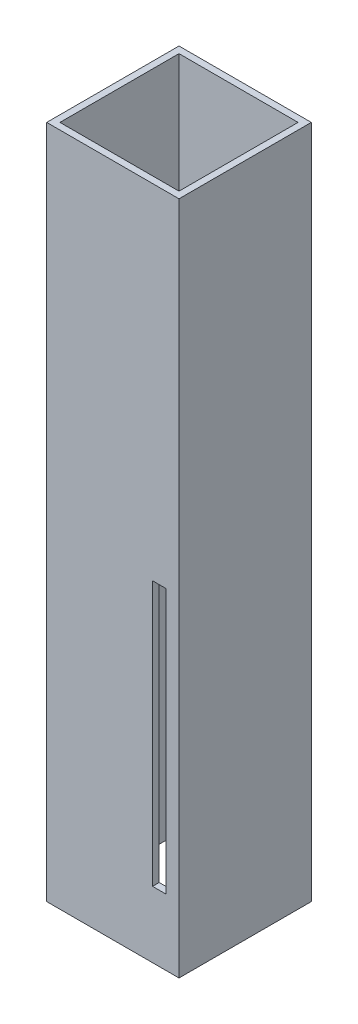
ISO-10303-21;
HEADER;
FILE_DESCRIPTION(('STEP AP214'),'2;1');
FILE_NAME('part.step','',(''),(''),'','','');
FILE_SCHEMA(('AUTOMOTIVE_DESIGN { 1 0 10303 214 1 1 1 1 }'));
ENDSEC;
DATA;
#1=APPLICATION_CONTEXT('core data for automotive mechanical design processes');
#2=APPLICATION_PROTOCOL_DEFINITION('international standard','automotive_design',2000,#1);
#3=PRODUCT_CONTEXT('',#1,'mechanical');
#4=PRODUCT('Part','Part','',(#3));
#5=PRODUCT_RELATED_PRODUCT_CATEGORY('part','',(#4));
#6=PRODUCT_DEFINITION_FORMATION('','',#4);
#7=PRODUCT_DEFINITION_CONTEXT('part definition',#1,'design');
#8=PRODUCT_DEFINITION('design','',#6,#7);
#9=PRODUCT_DEFINITION_SHAPE('','',#8);
#10=(LENGTH_UNIT() NAMED_UNIT(*) SI_UNIT(.MILLI.,.METRE.));
#11=(NAMED_UNIT(*) PLANE_ANGLE_UNIT() SI_UNIT($,.RADIAN.));
#12=(NAMED_UNIT(*) SI_UNIT($,.STERADIAN.) SOLID_ANGLE_UNIT());
#13=UNCERTAINTY_MEASURE_WITH_UNIT(LENGTH_MEASURE(1.E-05),#10,'distance_accuracy_value','');
#14=(GEOMETRIC_REPRESENTATION_CONTEXT(3) GLOBAL_UNCERTAINTY_ASSIGNED_CONTEXT((#13)) GLOBAL_UNIT_ASSIGNED_CONTEXT((#10,
#11,#12)) REPRESENTATION_CONTEXT('',''));
#15=CARTESIAN_POINT('',(0.,0.,0.));
#16=DIRECTION('',(0.,0.,1.));
#17=DIRECTION('',(1.,0.,0.));
#18=AXIS2_PLACEMENT_3D('',#15,#16,#17);
#19=CARTESIAN_POINT('',(0.,25.5,0.));
#20=DIRECTION('',(0.,-1.,0.));
#21=DIRECTION('',(0.,0.,-1.));
#22=AXIS2_PLACEMENT_3D('',#19,#20,#21);
#23=PLANE('',#22);
#24=DIRECTION('',(0.,0.,-1.));
#25=VECTOR('',#24,1.);
#26=CARTESIAN_POINT('',(2.50000000000003,25.5,2.5));
#27=LINE('',#26,#25);
#28=CARTESIAN_POINT('',(2.50000000000003,25.5,2.5));
#29=VERTEX_POINT('',#28);
#30=CARTESIAN_POINT('',(2.50000000000003,25.5,-2.5));
#31=VERTEX_POINT('',#30);
#32=EDGE_CURVE('E232',#29,#31,#27,.T.);
#33=ORIENTED_EDGE('',*,*,#32,.T.);
#34=DIRECTION('',(-1.,0.,0.));
#35=VECTOR('',#34,1.);
#36=CARTESIAN_POINT('',(-2.49999999999997,25.5,-2.5));
#37=LINE('',#36,#35);
#38=CARTESIAN_POINT('',(-2.49999999999997,25.5,-2.5));
#39=VERTEX_POINT('',#38);
#40=EDGE_CURVE('E235',#31,#39,#37,.T.);
#41=ORIENTED_EDGE('',*,*,#40,.T.);
#42=DIRECTION('',(0.,0.,1.));
#43=VECTOR('',#42,1.);
#44=CARTESIAN_POINT('',(-2.49999999999997,25.5,2.5));
#45=LINE('',#44,#43);
#46=CARTESIAN_POINT('',(-2.49999999999997,25.5,2.5));
#47=VERTEX_POINT('',#46);
#48=EDGE_CURVE('E238',#39,#47,#45,.T.);
#49=ORIENTED_EDGE('',*,*,#48,.T.);
#50=DIRECTION('',(1.,0.,0.));
#51=VECTOR('',#50,1.);
#52=CARTESIAN_POINT('',(-2.49999999999997,25.5,2.5));
#53=LINE('',#52,#51);
#54=EDGE_CURVE('E240',#47,#29,#53,.T.);
#55=ORIENTED_EDGE('',*,*,#54,.T.);
#56=EDGE_LOOP('',(#33,#41,#49,#55));
#57=FACE_BOUND('',#56,.T.);
#58=DIRECTION('',(0.,0.,-1.));
#59=VECTOR('',#58,1.);
#60=CARTESIAN_POINT('',(2.25000000000003,25.5,2.25));
#61=LINE('',#60,#59);
#62=CARTESIAN_POINT('',(2.25000000000003,25.5,2.25));
#63=VERTEX_POINT('',#62);
#64=CARTESIAN_POINT('',(2.25000000000003,25.5,-2.25));
#65=VERTEX_POINT('',#64);
#66=EDGE_CURVE('E201',#63,#65,#61,.T.);
#67=ORIENTED_EDGE('',*,*,#66,.F.);
#68=DIRECTION('',(1.,0.,0.));
#69=VECTOR('',#68,1.);
#70=CARTESIAN_POINT('',(-2.24999999999997,25.5,2.25));
#71=LINE('',#70,#69);
#72=CARTESIAN_POINT('',(-2.24999999999997,25.5,2.25));
#73=VERTEX_POINT('',#72);
#74=EDGE_CURVE('E209',#73,#63,#71,.T.);
#75=ORIENTED_EDGE('',*,*,#74,.F.);
#76=DIRECTION('',(0.,0.,1.));
#77=VECTOR('',#76,1.);
#78=CARTESIAN_POINT('',(-2.24999999999997,25.5,2.25));
#79=LINE('',#78,#77);
#80=CARTESIAN_POINT('',(-2.24999999999997,25.5,-2.25));
#81=VERTEX_POINT('',#80);
#82=EDGE_CURVE('E206',#81,#73,#79,.T.);
#83=ORIENTED_EDGE('',*,*,#82,.F.);
#84=DIRECTION('',(-1.,0.,0.));
#85=VECTOR('',#84,1.);
#86=CARTESIAN_POINT('',(-2.24999999999997,25.5,-2.25));
#87=LINE('',#86,#85);
#88=EDGE_CURVE('E203',#65,#81,#87,.T.);
#89=ORIENTED_EDGE('',*,*,#88,.F.);
#90=EDGE_LOOP('',(#67,#75,#83,#89));
#91=FACE_BOUND('',#90,.T.);
#92=ADVANCED_FACE('F33',(#57,#91),#23,.F.);
#93=CARTESIAN_POINT('',(0.,0.,0.));
#94=DIRECTION('',(0.,-1.,0.));
#95=DIRECTION('',(0.,0.,-1.));
#96=AXIS2_PLACEMENT_3D('',#93,#94,#95);
#97=PLANE('',#96);
#98=DIRECTION('',(0.,0.,-1.));
#99=VECTOR('',#98,1.);
#100=CARTESIAN_POINT('',(2.50000000000003,0.,2.5));
#101=LINE('',#100,#99);
#102=CARTESIAN_POINT('',(2.50000000000003,0.,2.5));
#103=VERTEX_POINT('',#102);
#104=CARTESIAN_POINT('',(2.50000000000003,0.,-2.5));
#105=VERTEX_POINT('',#104);
#106=EDGE_CURVE('E231',#103,#105,#101,.T.);
#107=ORIENTED_EDGE('',*,*,#106,.F.);
#108=DIRECTION('',(1.,0.,0.));
#109=VECTOR('',#108,1.);
#110=CARTESIAN_POINT('',(-2.49999999999997,0.,2.5));
#111=LINE('',#110,#109);
#112=CARTESIAN_POINT('',(-2.49999999999997,0.,2.5));
#113=VERTEX_POINT('',#112);
#114=EDGE_CURVE('E236',#113,#103,#111,.T.);
#115=ORIENTED_EDGE('',*,*,#114,.F.);
#116=DIRECTION('',(0.,0.,1.));
#117=VECTOR('',#116,1.);
#118=CARTESIAN_POINT('',(-2.49999999999997,0.,2.5));
#119=LINE('',#118,#117);
#120=CARTESIAN_POINT('',(-2.49999999999997,0.,-2.5));
#121=VERTEX_POINT('',#120);
#122=EDGE_CURVE('E247',#121,#113,#119,.T.);
#123=ORIENTED_EDGE('',*,*,#122,.F.);
#124=DIRECTION('',(-1.,0.,0.));
#125=VECTOR('',#124,1.);
#126=CARTESIAN_POINT('',(-2.49999999999997,0.,-2.5));
#127=LINE('',#126,#125);
#128=EDGE_CURVE('E245',#105,#121,#127,.T.);
#129=ORIENTED_EDGE('',*,*,#128,.F.);
#130=EDGE_LOOP('',(#107,#115,#123,#129));
#131=FACE_BOUND('',#130,.T.);
#132=DIRECTION('',(1.,0.,0.));
#133=VECTOR('',#132,1.);
#134=CARTESIAN_POINT('',(-2.24999999999997,0.,2.25));
#135=LINE('',#134,#133);
#136=CARTESIAN_POINT('',(-2.24999999999997,0.,2.25));
#137=VERTEX_POINT('',#136);
#138=CARTESIAN_POINT('',(2.25000000000003,0.,2.25));
#139=VERTEX_POINT('',#138);
#140=EDGE_CURVE('E204',#137,#139,#135,.T.);
#141=ORIENTED_EDGE('',*,*,#140,.T.);
#142=DIRECTION('',(0.,0.,-1.));
#143=VECTOR('',#142,1.);
#144=CARTESIAN_POINT('',(2.25000000000003,0.,2.25));
#145=LINE('',#144,#143);
#146=CARTESIAN_POINT('',(2.25000000000003,0.,-2.25));
#147=VERTEX_POINT('',#146);
#148=EDGE_CURVE('E200',#139,#147,#145,.T.);
#149=ORIENTED_EDGE('',*,*,#148,.T.);
#150=DIRECTION('',(-1.,0.,0.));
#151=VECTOR('',#150,1.);
#152=CARTESIAN_POINT('',(-2.24999999999997,0.,-2.25));
#153=LINE('',#152,#151);
#154=CARTESIAN_POINT('',(-2.24999999999997,0.,-2.25));
#155=VERTEX_POINT('',#154);
#156=EDGE_CURVE('E214',#147,#155,#153,.T.);
#157=ORIENTED_EDGE('',*,*,#156,.T.);
#158=DIRECTION('',(0.,0.,1.));
#159=VECTOR('',#158,1.);
#160=CARTESIAN_POINT('',(-2.24999999999997,0.,2.25));
#161=LINE('',#160,#159);
#162=EDGE_CURVE('E217',#155,#137,#161,.T.);
#163=ORIENTED_EDGE('',*,*,#162,.T.);
#164=EDGE_LOOP('',(#141,#149,#157,#163));
#165=FACE_BOUND('',#164,.T.);
#166=ADVANCED_FACE('F301',(#131,#165),#97,.T.);
#167=CARTESIAN_POINT('',(2.50000000000003,25.5,2.5));
#168=DIRECTION('',(-1.,0.,0.));
#169=DIRECTION('',(0.,0.,1.));
#170=AXIS2_PLACEMENT_3D('',#167,#168,#169);
#171=PLANE('',#170);
#172=ORIENTED_EDGE('',*,*,#106,.T.);
#173=DIRECTION('',(0.,-1.,0.));
#174=VECTOR('',#173,1.);
#175=CARTESIAN_POINT('',(2.50000000000003,25.5,-2.5));
#176=LINE('',#175,#174);
#177=EDGE_CURVE('E258',#31,#105,#176,.T.);
#178=ORIENTED_EDGE('',*,*,#177,.F.);
#179=ORIENTED_EDGE('',*,*,#32,.F.);
#180=DIRECTION('',(0.,-1.,0.));
#181=VECTOR('',#180,1.);
#182=CARTESIAN_POINT('',(2.50000000000003,25.5,2.5));
#183=LINE('',#182,#181);
#184=EDGE_CURVE('E242',#29,#103,#183,.T.);
#185=ORIENTED_EDGE('',*,*,#184,.T.);
#186=EDGE_LOOP('',(#172,#178,#179,#185));
#187=FACE_BOUND('',#186,.T.);
#188=ADVANCED_FACE('F35',(#187),#171,.F.);
#189=CARTESIAN_POINT('',(-2.49999999999997,25.5,-2.5));
#190=DIRECTION('',(0.,0.,1.));
#191=DIRECTION('',(1.,0.,0.));
#192=AXIS2_PLACEMENT_3D('',#189,#190,#191);
#193=PLANE('',#192);
#194=DIRECTION('',(-1.,0.,0.));
#195=VECTOR('',#194,1.);
#196=CARTESIAN_POINT('',(1.50000000000003,12.5,-2.5));
#197=LINE('',#196,#195);
#198=CARTESIAN_POINT('',(2.00000000000003,12.5,-2.5));
#199=VERTEX_POINT('',#198);
#200=CARTESIAN_POINT('',(1.50000000000003,12.5,-2.5));
#201=VERTEX_POINT('',#200);
#202=EDGE_CURVE('E168',#199,#201,#197,.T.);
#203=ORIENTED_EDGE('',*,*,#202,.T.);
#204=DIRECTION('',(0.,-1.,0.));
#205=VECTOR('',#204,1.);
#206=CARTESIAN_POINT('',(1.50000000000003,2.5,-2.5));
#207=LINE('',#206,#205);
#208=CARTESIAN_POINT('',(1.50000000000003,2.5,-2.5));
#209=VERTEX_POINT('',#208);
#210=EDGE_CURVE('E151',#201,#209,#207,.T.);
#211=ORIENTED_EDGE('',*,*,#210,.T.);
#212=DIRECTION('',(1.,0.,0.));
#213=VECTOR('',#212,1.);
#214=CARTESIAN_POINT('',(1.50000000000003,2.5,-2.5));
#215=LINE('',#214,#213);
#216=CARTESIAN_POINT('',(2.00000000000003,2.5,-2.5));
#217=VERTEX_POINT('',#216);
#218=EDGE_CURVE('E160',#209,#217,#215,.T.);
#219=ORIENTED_EDGE('',*,*,#218,.T.);
#220=DIRECTION('',(0.,1.,0.));
#221=VECTOR('',#220,1.);
#222=CARTESIAN_POINT('',(2.00000000000003,2.5,-2.5));
#223=LINE('',#222,#221);
#224=EDGE_CURVE('E48',#217,#199,#223,.T.);
#225=ORIENTED_EDGE('',*,*,#224,.T.);
#226=EDGE_LOOP('',(#203,#211,#219,#225));
#227=FACE_BOUND('',#226,.T.);
#228=ORIENTED_EDGE('',*,*,#128,.T.);
#229=DIRECTION('',(0.,-1.,0.));
#230=VECTOR('',#229,1.);
#231=CARTESIAN_POINT('',(-2.49999999999997,25.5,-2.5));
#232=LINE('',#231,#230);
#233=EDGE_CURVE('E255',#39,#121,#232,.T.);
#234=ORIENTED_EDGE('',*,*,#233,.F.);
#235=ORIENTED_EDGE('',*,*,#40,.F.);
#236=ORIENTED_EDGE('',*,*,#177,.T.);
#237=EDGE_LOOP('',(#228,#234,#235,#236));
#238=FACE_BOUND('',#237,.T.);
#239=ADVANCED_FACE('F165',(#227,#238),#193,.F.);
#240=CARTESIAN_POINT('',(-2.49999999999997,25.5,2.5));
#241=DIRECTION('',(1.,0.,0.));
#242=DIRECTION('',(0.,0.,-1.));
#243=AXIS2_PLACEMENT_3D('',#240,#241,#242);
#244=PLANE('',#243);
#245=ORIENTED_EDGE('',*,*,#122,.T.);
#246=DIRECTION('',(0.,-1.,0.));
#247=VECTOR('',#246,1.);
#248=CARTESIAN_POINT('',(-2.49999999999997,25.5,2.5));
#249=LINE('',#248,#247);
#250=EDGE_CURVE('E252',#47,#113,#249,.T.);
#251=ORIENTED_EDGE('',*,*,#250,.F.);
#252=ORIENTED_EDGE('',*,*,#48,.F.);
#253=ORIENTED_EDGE('',*,*,#233,.T.);
#254=EDGE_LOOP('',(#245,#251,#252,#253));
#255=FACE_BOUND('',#254,.T.);
#256=ADVANCED_FACE('F289',(#255),#244,.F.);
#257=CARTESIAN_POINT('',(-2.49999999999997,25.5,2.5));
#258=DIRECTION('',(0.,0.,-1.));
#259=DIRECTION('',(-1.,0.,0.));
#260=AXIS2_PLACEMENT_3D('',#257,#258,#259);
#261=PLANE('',#260);
#262=DIRECTION('',(-1.,0.,0.));
#263=VECTOR('',#262,1.);
#264=CARTESIAN_POINT('',(-2.49999999999997,2.5,2.5));
#265=LINE('',#264,#263);
#266=CARTESIAN_POINT('',(2.00000000000003,2.5,2.5));
#267=VERTEX_POINT('',#266);
#268=CARTESIAN_POINT('',(1.50000000000003,2.5,2.5));
#269=VERTEX_POINT('',#268);
#270=EDGE_CURVE('E183',#267,#269,#265,.T.);
#271=ORIENTED_EDGE('',*,*,#270,.T.);
#272=DIRECTION('',(0.,1.,0.));
#273=VECTOR('',#272,1.);
#274=CARTESIAN_POINT('',(1.50000000000003,25.5,2.5));
#275=LINE('',#274,#273);
#276=CARTESIAN_POINT('',(1.50000000000003,12.5,2.5));
#277=VERTEX_POINT('',#276);
#278=EDGE_CURVE('E197',#269,#277,#275,.T.);
#279=ORIENTED_EDGE('',*,*,#278,.T.);
#280=DIRECTION('',(1.,0.,0.));
#281=VECTOR('',#280,1.);
#282=CARTESIAN_POINT('',(-2.49999999999997,12.5,2.5));
#283=LINE('',#282,#281);
#284=CARTESIAN_POINT('',(2.00000000000003,12.5,2.5));
#285=VERTEX_POINT('',#284);
#286=EDGE_CURVE('E193',#277,#285,#283,.T.);
#287=ORIENTED_EDGE('',*,*,#286,.T.);
#288=DIRECTION('',(0.,-1.,0.));
#289=VECTOR('',#288,1.);
#290=CARTESIAN_POINT('',(2.00000000000003,25.5,2.5));
#291=LINE('',#290,#289);
#292=EDGE_CURVE('E188',#285,#267,#291,.T.);
#293=ORIENTED_EDGE('',*,*,#292,.T.);
#294=EDGE_LOOP('',(#271,#279,#287,#293));
#295=FACE_BOUND('',#294,.T.);
#296=ORIENTED_EDGE('',*,*,#114,.T.);
#297=ORIENTED_EDGE('',*,*,#184,.F.);
#298=ORIENTED_EDGE('',*,*,#54,.F.);
#299=ORIENTED_EDGE('',*,*,#250,.T.);
#300=EDGE_LOOP('',(#296,#297,#298,#299));
#301=FACE_BOUND('',#300,.T.);
#302=ADVANCED_FACE('F285',(#295,#301),#261,.F.);
#303=CARTESIAN_POINT('',(2.25000000000003,25.5,2.25));
#304=DIRECTION('',(-1.,0.,0.));
#305=DIRECTION('',(0.,0.,1.));
#306=AXIS2_PLACEMENT_3D('',#303,#304,#305);
#307=PLANE('',#306);
#308=ORIENTED_EDGE('',*,*,#148,.F.);
#309=DIRECTION('',(0.,-1.,0.));
#310=VECTOR('',#309,1.);
#311=CARTESIAN_POINT('',(2.25000000000003,25.5,2.25));
#312=LINE('',#311,#310);
#313=EDGE_CURVE('E211',#63,#139,#312,.T.);
#314=ORIENTED_EDGE('',*,*,#313,.F.);
#315=ORIENTED_EDGE('',*,*,#66,.T.);
#316=DIRECTION('',(0.,-1.,0.));
#317=VECTOR('',#316,1.);
#318=CARTESIAN_POINT('',(2.25000000000003,25.5,-2.25));
#319=LINE('',#318,#317);
#320=EDGE_CURVE('E228',#65,#147,#319,.T.);
#321=ORIENTED_EDGE('',*,*,#320,.T.);
#322=EDGE_LOOP('',(#308,#314,#315,#321));
#323=FACE_BOUND('',#322,.T.);
#324=ADVANCED_FACE('F288',(#323),#307,.T.);
#325=CARTESIAN_POINT('',(-2.24999999999997,25.5,-2.25));
#326=DIRECTION('',(0.,0.,1.));
#327=DIRECTION('',(1.,0.,0.));
#328=AXIS2_PLACEMENT_3D('',#325,#326,#327);
#329=PLANE('',#328);
#330=DIRECTION('',(0.,-1.,0.));
#331=VECTOR('',#330,1.);
#332=CARTESIAN_POINT('',(1.50000000000003,25.5,-2.25));
#333=LINE('',#332,#331);
#334=CARTESIAN_POINT('',(1.50000000000003,12.5,-2.25));
#335=VERTEX_POINT('',#334);
#336=CARTESIAN_POINT('',(1.50000000000003,2.5,-2.25));
#337=VERTEX_POINT('',#336);
#338=EDGE_CURVE('E154',#335,#337,#333,.T.);
#339=ORIENTED_EDGE('',*,*,#338,.F.);
#340=DIRECTION('',(-1.,0.,0.));
#341=VECTOR('',#340,1.);
#342=CARTESIAN_POINT('',(-2.24999999999997,12.5,-2.25));
#343=LINE('',#342,#341);
#344=CARTESIAN_POINT('',(2.00000000000003,12.5,-2.25));
#345=VERTEX_POINT('',#344);
#346=EDGE_CURVE('E191',#345,#335,#343,.T.);
#347=ORIENTED_EDGE('',*,*,#346,.F.);
#348=DIRECTION('',(0.,1.,0.));
#349=VECTOR('',#348,1.);
#350=CARTESIAN_POINT('',(2.00000000000003,25.5,-2.25));
#351=LINE('',#350,#349);
#352=CARTESIAN_POINT('',(2.00000000000003,2.5,-2.25));
#353=VERTEX_POINT('',#352);
#354=EDGE_CURVE('E186',#353,#345,#351,.T.);
#355=ORIENTED_EDGE('',*,*,#354,.F.);
#356=DIRECTION('',(1.,0.,0.));
#357=VECTOR('',#356,1.);
#358=CARTESIAN_POINT('',(-2.24999999999997,2.5,-2.25));
#359=LINE('',#358,#357);
#360=EDGE_CURVE('E175',#337,#353,#359,.T.);
#361=ORIENTED_EDGE('',*,*,#360,.F.);
#362=EDGE_LOOP('',(#339,#347,#355,#361));
#363=FACE_BOUND('',#362,.T.);
#364=ORIENTED_EDGE('',*,*,#156,.F.);
#365=ORIENTED_EDGE('',*,*,#320,.F.);
#366=ORIENTED_EDGE('',*,*,#88,.T.);
#367=DIRECTION('',(0.,-1.,0.));
#368=VECTOR('',#367,1.);
#369=CARTESIAN_POINT('',(-2.24999999999997,25.5,-2.25));
#370=LINE('',#369,#368);
#371=EDGE_CURVE('E226',#81,#155,#370,.T.);
#372=ORIENTED_EDGE('',*,*,#371,.T.);
#373=EDGE_LOOP('',(#364,#365,#366,#372));
#374=FACE_BOUND('',#373,.T.);
#375=ADVANCED_FACE('F322',(#363,#374),#329,.T.);
#376=CARTESIAN_POINT('',(-2.24999999999997,25.5,2.25));
#377=DIRECTION('',(1.,0.,0.));
#378=DIRECTION('',(0.,0.,-1.));
#379=AXIS2_PLACEMENT_3D('',#376,#377,#378);
#380=PLANE('',#379);
#381=ORIENTED_EDGE('',*,*,#162,.F.);
#382=ORIENTED_EDGE('',*,*,#371,.F.);
#383=ORIENTED_EDGE('',*,*,#82,.T.);
#384=DIRECTION('',(0.,-1.,0.));
#385=VECTOR('',#384,1.);
#386=CARTESIAN_POINT('',(-2.24999999999997,25.5,2.25));
#387=LINE('',#386,#385);
#388=EDGE_CURVE('E224',#73,#137,#387,.T.);
#389=ORIENTED_EDGE('',*,*,#388,.T.);
#390=EDGE_LOOP('',(#381,#382,#383,#389));
#391=FACE_BOUND('',#390,.T.);
#392=ADVANCED_FACE('F326',(#391),#380,.T.);
#393=CARTESIAN_POINT('',(-2.24999999999997,25.5,2.25));
#394=DIRECTION('',(0.,0.,-1.));
#395=DIRECTION('',(-1.,0.,0.));
#396=AXIS2_PLACEMENT_3D('',#393,#394,#395);
#397=PLANE('',#396);
#398=DIRECTION('',(0.,1.,0.));
#399=VECTOR('',#398,1.);
#400=CARTESIAN_POINT('',(1.50000000000003,25.5,2.25));
#401=LINE('',#400,#399);
#402=CARTESIAN_POINT('',(1.50000000000003,2.5,2.25));
#403=VERTEX_POINT('',#402);
#404=CARTESIAN_POINT('',(1.50000000000003,12.5,2.25));
#405=VERTEX_POINT('',#404);
#406=EDGE_CURVE('E11',#403,#405,#401,.T.);
#407=ORIENTED_EDGE('',*,*,#406,.F.);
#408=DIRECTION('',(-1.,0.,0.));
#409=VECTOR('',#408,1.);
#410=CARTESIAN_POINT('',(-2.24999999999997,2.5,2.25));
#411=LINE('',#410,#409);
#412=CARTESIAN_POINT('',(2.00000000000003,2.5,2.25));
#413=VERTEX_POINT('',#412);
#414=EDGE_CURVE('E261',#413,#403,#411,.T.);
#415=ORIENTED_EDGE('',*,*,#414,.F.);
#416=DIRECTION('',(0.,-1.,0.));
#417=VECTOR('',#416,1.);
#418=CARTESIAN_POINT('',(2.00000000000003,25.5,2.25));
#419=LINE('',#418,#417);
#420=CARTESIAN_POINT('',(2.00000000000003,12.5,2.25));
#421=VERTEX_POINT('',#420);
#422=EDGE_CURVE('E263',#421,#413,#419,.T.);
#423=ORIENTED_EDGE('',*,*,#422,.F.);
#424=DIRECTION('',(1.,0.,0.));
#425=VECTOR('',#424,1.);
#426=CARTESIAN_POINT('',(-2.24999999999997,12.5,2.25));
#427=LINE('',#426,#425);
#428=EDGE_CURVE('E41',#405,#421,#427,.T.);
#429=ORIENTED_EDGE('',*,*,#428,.F.);
#430=EDGE_LOOP('',(#407,#415,#423,#429));
#431=FACE_BOUND('',#430,.T.);
#432=ORIENTED_EDGE('',*,*,#140,.F.);
#433=ORIENTED_EDGE('',*,*,#388,.F.);
#434=ORIENTED_EDGE('',*,*,#74,.T.);
#435=ORIENTED_EDGE('',*,*,#313,.T.);
#436=EDGE_LOOP('',(#432,#433,#434,#435));
#437=FACE_BOUND('',#436,.T.);
#438=ADVANCED_FACE('F279',(#431,#437),#397,.T.);
#439=CARTESIAN_POINT('',(1.50000000000003,2.5,-2.5));
#440=DIRECTION('',(0.,-1.,0.));
#441=DIRECTION('',(0.,0.,-1.));
#442=AXIS2_PLACEMENT_3D('',#439,#440,#441);
#443=PLANE('',#442);
#444=DIRECTION('',(0.,0.,1.));
#445=VECTOR('',#444,1.);
#446=CARTESIAN_POINT('',(2.00000000000003,2.5,-2.5));
#447=LINE('',#446,#445);
#448=EDGE_CURVE('E157',#413,#267,#447,.T.);
#449=ORIENTED_EDGE('',*,*,#448,.F.);
#450=ORIENTED_EDGE('',*,*,#414,.T.);
#451=DIRECTION('',(0.,0.,1.));
#452=VECTOR('',#451,1.);
#453=CARTESIAN_POINT('',(1.50000000000003,2.5,-2.5));
#454=LINE('',#453,#452);
#455=EDGE_CURVE('E56',#403,#269,#454,.T.);
#456=ORIENTED_EDGE('',*,*,#455,.T.);
#457=ORIENTED_EDGE('',*,*,#270,.F.);
#458=EDGE_LOOP('',(#449,#450,#456,#457));
#459=FACE_BOUND('',#458,.T.);
#460=ADVANCED_FACE('F281',(#459),#443,.F.);
#461=CARTESIAN_POINT('',(2.00000000000003,2.5,-2.5));
#462=DIRECTION('',(1.,0.,0.));
#463=DIRECTION('',(0.,0.,-1.));
#464=AXIS2_PLACEMENT_3D('',#461,#462,#463);
#465=PLANE('',#464);
#466=DIRECTION('',(0.,0.,1.));
#467=VECTOR('',#466,1.);
#468=CARTESIAN_POINT('',(2.00000000000003,12.5,-2.5));
#469=LINE('',#468,#467);
#470=EDGE_CURVE('E180',#421,#285,#469,.T.);
#471=ORIENTED_EDGE('',*,*,#470,.F.);
#472=ORIENTED_EDGE('',*,*,#422,.T.);
#473=ORIENTED_EDGE('',*,*,#448,.T.);
#474=ORIENTED_EDGE('',*,*,#292,.F.);
#475=EDGE_LOOP('',(#471,#472,#473,#474));
#476=FACE_BOUND('',#475,.T.);
#477=ADVANCED_FACE('F276',(#476),#465,.F.);
#478=CARTESIAN_POINT('',(1.50000000000003,12.5,-2.5));
#479=DIRECTION('',(0.,1.,0.));
#480=DIRECTION('',(0.,0.,1.));
#481=AXIS2_PLACEMENT_3D('',#478,#479,#480);
#482=PLANE('',#481);
#483=DIRECTION('',(0.,0.,1.));
#484=VECTOR('',#483,1.);
#485=CARTESIAN_POINT('',(1.50000000000003,12.5,-2.5));
#486=LINE('',#485,#484);
#487=EDGE_CURVE('E176',#405,#277,#486,.T.);
#488=ORIENTED_EDGE('',*,*,#487,.F.);
#489=ORIENTED_EDGE('',*,*,#428,.T.);
#490=ORIENTED_EDGE('',*,*,#470,.T.);
#491=ORIENTED_EDGE('',*,*,#286,.F.);
#492=EDGE_LOOP('',(#488,#489,#490,#491));
#493=FACE_BOUND('',#492,.T.);
#494=ADVANCED_FACE('F270',(#493),#482,.F.);
#495=CARTESIAN_POINT('',(1.50000000000003,2.5,-2.5));
#496=DIRECTION('',(-1.,0.,0.));
#497=DIRECTION('',(0.,0.,1.));
#498=AXIS2_PLACEMENT_3D('',#495,#496,#497);
#499=PLANE('',#498);
#500=ORIENTED_EDGE('',*,*,#455,.F.);
#501=ORIENTED_EDGE('',*,*,#406,.T.);
#502=ORIENTED_EDGE('',*,*,#487,.T.);
#503=ORIENTED_EDGE('',*,*,#278,.F.);
#504=EDGE_LOOP('',(#500,#501,#502,#503));
#505=FACE_BOUND('',#504,.T.);
#506=ADVANCED_FACE('F283',(#505),#499,.F.);
#507=ORIENTED_EDGE('',*,*,#338,.T.);
#508=EDGE_CURVE('E146',#209,#337,#454,.T.);
#509=ORIENTED_EDGE('',*,*,#508,.F.);
#510=ORIENTED_EDGE('',*,*,#210,.F.);
#511=EDGE_CURVE('E173',#201,#335,#486,.T.);
#512=ORIENTED_EDGE('',*,*,#511,.T.);
#513=EDGE_LOOP('',(#507,#509,#510,#512));
#514=FACE_BOUND('',#513,.T.);
#515=ADVANCED_FACE('F148',(#514),#499,.F.);
#516=ORIENTED_EDGE('',*,*,#346,.T.);
#517=ORIENTED_EDGE('',*,*,#511,.F.);
#518=ORIENTED_EDGE('',*,*,#202,.F.);
#519=EDGE_CURVE('E177',#199,#345,#469,.T.);
#520=ORIENTED_EDGE('',*,*,#519,.T.);
#521=EDGE_LOOP('',(#516,#517,#518,#520));
#522=FACE_BOUND('',#521,.T.);
#523=ADVANCED_FACE('F341',(#522),#482,.F.);
#524=ORIENTED_EDGE('',*,*,#354,.T.);
#525=ORIENTED_EDGE('',*,*,#519,.F.);
#526=ORIENTED_EDGE('',*,*,#224,.F.);
#527=EDGE_CURVE('E162',#217,#353,#447,.T.);
#528=ORIENTED_EDGE('',*,*,#527,.T.);
#529=EDGE_LOOP('',(#524,#525,#526,#528));
#530=FACE_BOUND('',#529,.T.);
#531=ADVANCED_FACE('F339',(#530),#465,.F.);
#532=ORIENTED_EDGE('',*,*,#360,.T.);
#533=ORIENTED_EDGE('',*,*,#527,.F.);
#534=ORIENTED_EDGE('',*,*,#218,.F.);
#535=ORIENTED_EDGE('',*,*,#508,.T.);
#536=EDGE_LOOP('',(#532,#533,#534,#535));
#537=FACE_BOUND('',#536,.T.);
#538=ADVANCED_FACE('F161',(#537),#443,.F.);
#539=CLOSED_SHELL('',(#92,#166,#188,#239,#256,#302,#324,#375,#392,#438,#460,#477,#494,#506,#515,
#523,#531,#538));
#540=MANIFOLD_SOLID_BREP('B2',#539);
#541=ADVANCED_BREP_SHAPE_REPRESENTATION('',(#18,#540),#14);
#542=SHAPE_DEFINITION_REPRESENTATION(#9,#541);
ENDSEC;
END-ISO-10303-21;
